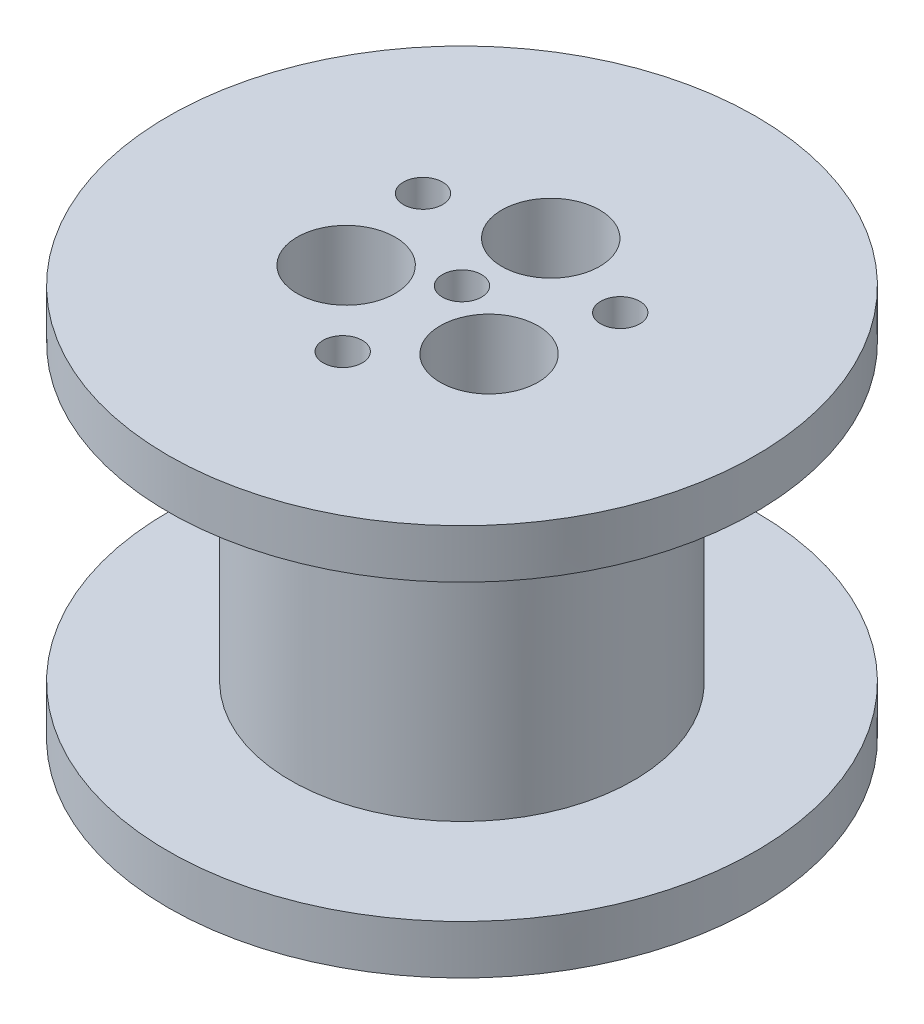
ISO-10303-21;
HEADER;
FILE_DESCRIPTION(('STEP AP214'),'2;1');
FILE_NAME('part.step','',(''),(''),'','','');
FILE_SCHEMA(('AUTOMOTIVE_DESIGN { 1 0 10303 214 1 1 1 1 }'));
ENDSEC;
DATA;
#1=APPLICATION_CONTEXT('core data for automotive mechanical design processes');
#2=APPLICATION_PROTOCOL_DEFINITION('international standard','automotive_design',2000,#1);
#3=PRODUCT_CONTEXT('',#1,'mechanical');
#4=PRODUCT('Part','Part','',(#3));
#5=PRODUCT_RELATED_PRODUCT_CATEGORY('part','',(#4));
#6=PRODUCT_DEFINITION_FORMATION('','',#4);
#7=PRODUCT_DEFINITION_CONTEXT('part definition',#1,'design');
#8=PRODUCT_DEFINITION('design','',#6,#7);
#9=PRODUCT_DEFINITION_SHAPE('','',#8);
#10=(LENGTH_UNIT() NAMED_UNIT(*) SI_UNIT(.MILLI.,.METRE.));
#11=(NAMED_UNIT(*) PLANE_ANGLE_UNIT() SI_UNIT($,.RADIAN.));
#12=(NAMED_UNIT(*) SI_UNIT($,.STERADIAN.) SOLID_ANGLE_UNIT());
#13=UNCERTAINTY_MEASURE_WITH_UNIT(LENGTH_MEASURE(1.E-05),#10,'distance_accuracy_value','');
#14=(GEOMETRIC_REPRESENTATION_CONTEXT(3) GLOBAL_UNCERTAINTY_ASSIGNED_CONTEXT((#13)) GLOBAL_UNIT_ASSIGNED_CONTEXT((#10,
#11,#12)) REPRESENTATION_CONTEXT('',''));
#15=CARTESIAN_POINT('',(0.,0.,0.));
#16=DIRECTION('',(0.,0.,1.));
#17=DIRECTION('',(1.,0.,0.));
#18=AXIS2_PLACEMENT_3D('',#15,#16,#17);
#19=CARTESIAN_POINT('',(0.,40.,0.));
#20=DIRECTION('',(0.,-1.,0.));
#21=DIRECTION('',(0.,0.,-1.));
#22=AXIS2_PLACEMENT_3D('',#19,#20,#21);
#23=CYLINDRICAL_SURFACE('',#22,30.);
#24=CARTESIAN_POINT('',(0.,40.,0.));
#25=DIRECTION('',(0.,1.,0.));
#26=DIRECTION('',(0.,0.,1.));
#27=AXIS2_PLACEMENT_3D('',#24,#25,#26);
#28=CIRCLE('',#27,30.);
#29=CARTESIAN_POINT('',(0.,40.,30.));
#30=VERTEX_POINT('',#29);
#31=EDGE_CURVE('E12',#30,#30,#28,.T.);
#32=ORIENTED_EDGE('',*,*,#31,.F.);
#33=EDGE_LOOP('',(#32));
#34=FACE_BOUND('',#33,.T.);
#35=CARTESIAN_POINT('',(0.,35.,0.));
#36=DIRECTION('',(0.,-1.,0.));
#37=DIRECTION('',(0.,0.,-1.));
#38=AXIS2_PLACEMENT_3D('',#35,#36,#37);
#39=CIRCLE('',#38,30.);
#40=CARTESIAN_POINT('',(0.,35.,-30.));
#41=VERTEX_POINT('',#40);
#42=EDGE_CURVE('E39',#41,#41,#39,.T.);
#43=ORIENTED_EDGE('',*,*,#42,.F.);
#44=EDGE_LOOP('',(#43));
#45=FACE_BOUND('',#44,.T.);
#46=ADVANCED_FACE('F35',(#34,#45),#23,.T.);
#47=CARTESIAN_POINT('',(0.,40.,0.));
#48=DIRECTION('',(0.,1.,0.));
#49=DIRECTION('',(0.,0.,1.));
#50=AXIS2_PLACEMENT_3D('',#47,#48,#49);
#51=PLANE('',#50);
#52=CARTESIAN_POINT('',(-0.27450383551459,40.,11.904684903192));
#53=DIRECTION('',(0.,1.,0.));
#54=DIRECTION('',(0.,0.,1.));
#55=AXIS2_PLACEMENT_3D('',#52,#53,#54);
#56=CIRCLE('',#55,2.);
#57=CARTESIAN_POINT('',(-0.27450383551459,40.,13.904684903192));
#58=VERTEX_POINT('',#57);
#59=EDGE_CURVE('E163',#58,#58,#56,.T.);
#60=ORIENTED_EDGE('',*,*,#59,.F.);
#61=EDGE_LOOP('',(#60));
#62=FACE_BOUND('',#61,.T.);
#63=CARTESIAN_POINT('',(-10.1720019326114,40.,-6.18976202331826));
#64=DIRECTION('',(0.,1.,0.));
#65=DIRECTION('',(0.,0.,1.));
#66=AXIS2_PLACEMENT_3D('',#63,#64,#65);
#67=CIRCLE('',#66,2.);
#68=CARTESIAN_POINT('',(-10.1720019326114,40.,-4.18976202331826));
#69=VERTEX_POINT('',#68);
#70=EDGE_CURVE('E168',#69,#69,#67,.T.);
#71=ORIENTED_EDGE('',*,*,#70,.F.);
#72=EDGE_LOOP('',(#71));
#73=FACE_BOUND('',#72,.T.);
#74=CARTESIAN_POINT('',(10.4464096450296,40.,-5.7142859537013));
#75=DIRECTION('',(0.,1.,0.));
#76=DIRECTION('',(0.,0.,1.));
#77=AXIS2_PLACEMENT_3D('',#74,#75,#76);
#78=CIRCLE('',#77,2.);
#79=CARTESIAN_POINT('',(10.4464096450296,40.,-3.7142859537013));
#80=VERTEX_POINT('',#79);
#81=EDGE_CURVE('E176',#80,#80,#78,.T.);
#82=ORIENTED_EDGE('',*,*,#81,.F.);
#83=EDGE_LOOP('',(#82));
#84=FACE_BOUND('',#83,.T.);
#85=CARTESIAN_POINT('',(0.317902701636574,40.,-8.74422311427903));
#86=DIRECTION('',(0.,-1.,0.));
#87=DIRECTION('',(0.,0.,-1.));
#88=AXIS2_PLACEMENT_3D('',#85,#86,#87);
#89=CIRCLE('',#88,5.);
#90=CARTESIAN_POINT('',(0.317902701636574,40.,-13.744223114279));
#91=VERTEX_POINT('',#90);
#92=EDGE_CURVE('E182',#91,#91,#89,.T.);
#93=ORIENTED_EDGE('',*,*,#92,.T.);
#94=EDGE_LOOP('',(#93));
#95=FACE_BOUND('',#94,.T.);
#96=CARTESIAN_POINT('',(7.41376800250643,40.,4.64742337268849));
#97=DIRECTION('',(0.,-1.,0.));
#98=DIRECTION('',(0.,0.,-1.));
#99=AXIS2_PLACEMENT_3D('',#96,#97,#98);
#100=CIRCLE('',#99,5.);
#101=CARTESIAN_POINT('',(7.41376800250643,40.,-0.352576627311507));
#102=VERTEX_POINT('',#101);
#103=EDGE_CURVE('E188',#102,#102,#100,.T.);
#104=ORIENTED_EDGE('',*,*,#103,.T.);
#105=EDGE_LOOP('',(#104));
#106=FACE_BOUND('',#105,.T.);
#107=CARTESIAN_POINT('',(-7.73167070414301,40.,4.09679974159054));
#108=DIRECTION('',(0.,-1.,0.));
#109=DIRECTION('',(0.,0.,-1.));
#110=AXIS2_PLACEMENT_3D('',#107,#108,#109);
#111=CIRCLE('',#110,5.);
#112=CARTESIAN_POINT('',(-7.73167070414301,40.,-0.903200258409464));
#113=VERTEX_POINT('',#112);
#114=EDGE_CURVE('E194',#113,#113,#111,.T.);
#115=ORIENTED_EDGE('',*,*,#114,.T.);
#116=EDGE_LOOP('',(#115));
#117=FACE_BOUND('',#116,.T.);
#118=CARTESIAN_POINT('',(0.,40.,0.));
#119=DIRECTION('',(0.,-1.,0.));
#120=DIRECTION('',(0.,0.,-1.));
#121=AXIS2_PLACEMENT_3D('',#118,#119,#120);
#122=CIRCLE('',#121,2.);
#123=CARTESIAN_POINT('',(0.,40.,-2.));
#124=VERTEX_POINT('',#123);
#125=EDGE_CURVE('E74',#124,#124,#122,.T.);
#126=ORIENTED_EDGE('',*,*,#125,.T.);
#127=EDGE_LOOP('',(#126));
#128=FACE_BOUND('',#127,.T.);
#129=ORIENTED_EDGE('',*,*,#31,.T.);
#130=EDGE_LOOP('',(#129));
#131=FACE_BOUND('',#130,.T.);
#132=ADVANCED_FACE('F94',(#62,#73,#84,#95,#106,#117,#128,#131),#51,.T.);
#133=CARTESIAN_POINT('',(0.,35.,0.));
#134=DIRECTION('',(0.,-1.,0.));
#135=DIRECTION('',(0.,0.,-1.));
#136=AXIS2_PLACEMENT_3D('',#133,#134,#135);
#137=PLANE('',#136);
#138=CARTESIAN_POINT('',(0.,35.,0.));
#139=DIRECTION('',(0.,-1.,0.));
#140=DIRECTION('',(0.,0.,-1.));
#141=AXIS2_PLACEMENT_3D('',#138,#139,#140);
#142=CIRCLE('',#141,17.5);
#143=CARTESIAN_POINT('',(0.,35.,-17.5));
#144=VERTEX_POINT('',#143);
#145=EDGE_CURVE('E62',#144,#144,#142,.T.);
#146=ORIENTED_EDGE('',*,*,#145,.F.);
#147=EDGE_LOOP('',(#146));
#148=FACE_BOUND('',#147,.T.);
#149=ORIENTED_EDGE('',*,*,#42,.T.);
#150=EDGE_LOOP('',(#149));
#151=FACE_BOUND('',#150,.T.);
#152=ADVANCED_FACE('F91',(#148,#151),#137,.T.);
#153=CARTESIAN_POINT('',(0.,5.,0.));
#154=DIRECTION('',(0.,-1.,0.));
#155=DIRECTION('',(0.,0.,-1.));
#156=AXIS2_PLACEMENT_3D('',#153,#154,#155);
#157=PLANE('',#156);
#158=CARTESIAN_POINT('',(0.,5.,0.));
#159=DIRECTION('',(0.,-1.,0.));
#160=DIRECTION('',(0.,0.,-1.));
#161=AXIS2_PLACEMENT_3D('',#158,#159,#160);
#162=CIRCLE('',#161,17.5);
#163=CARTESIAN_POINT('',(-14.2785338407005,5.,-10.1179776319169));
#164=VERTEX_POINT('',#163);
#165=CARTESIAN_POINT('',(-16.2005846637719,5.,-6.61748113347961));
#166=VERTEX_POINT('',#165);
#167=EDGE_CURVE('E63',#164,#166,#162,.T.);
#168=ORIENTED_EDGE('',*,*,#167,.T.);
#169=CARTESIAN_POINT('',(-15.3397371273536,5.,-8.42273499901836));
#170=DIRECTION('',(0.,1.,0.));
#171=DIRECTION('',(0.,0.,1.));
#172=AXIS2_PLACEMENT_3D('',#169,#170,#171);
#173=CIRCLE('',#172,2.);
#174=EDGE_CURVE('E51',#164,#166,#173,.T.);
#175=ORIENTED_EDGE('',*,*,#174,.F.);
#176=EDGE_LOOP('',(#168,#175));
#177=FACE_BOUND('',#176,.T.);
#178=CARTESIAN_POINT('',(0.,5.,0.));
#179=DIRECTION('',(0.,-1.,0.));
#180=DIRECTION('',(0.,0.,-1.));
#181=AXIS2_PLACEMENT_3D('',#178,#179,#180);
#182=CIRCLE('',#181,30.);
#183=CARTESIAN_POINT('',(0.,5.,-30.));
#184=VERTEX_POINT('',#183);
#185=EDGE_CURVE('E82',#184,#184,#182,.T.);
#186=ORIENTED_EDGE('',*,*,#185,.F.);
#187=EDGE_LOOP('',(#186));
#188=FACE_BOUND('',#187,.T.);
#189=ADVANCED_FACE('F70',(#177,#188),#157,.F.);
#190=CARTESIAN_POINT('',(0.,35.,0.));
#191=DIRECTION('',(0.,-1.,0.));
#192=DIRECTION('',(0.,0.,-1.));
#193=AXIS2_PLACEMENT_3D('',#190,#191,#192);
#194=CYLINDRICAL_SURFACE('',#193,17.5);
#195=ORIENTED_EDGE('',*,*,#145,.T.);
#196=EDGE_LOOP('',(#195));
#197=FACE_BOUND('',#196,.T.);
#198=EDGE_CURVE('E56',#166,#164,#162,.T.);
#199=ORIENTED_EDGE('',*,*,#198,.F.);
#200=ORIENTED_EDGE('',*,*,#167,.F.);
#201=EDGE_LOOP('',(#199,#200));
#202=FACE_BOUND('',#201,.T.);
#203=ADVANCED_FACE('F73',(#197,#202),#194,.T.);
#204=CARTESIAN_POINT('',(0.,0.,0.));
#205=DIRECTION('',(0.,1.,0.));
#206=DIRECTION('',(0.,0.,1.));
#207=AXIS2_PLACEMENT_3D('',#204,#205,#206);
#208=PLANE('',#207);
#209=CARTESIAN_POINT('',(-0.27450383551459,0.,11.904684903192));
#210=DIRECTION('',(0.,1.,0.));
#211=DIRECTION('',(0.,0.,1.));
#212=AXIS2_PLACEMENT_3D('',#209,#210,#211);
#213=CIRCLE('',#212,2.);
#214=CARTESIAN_POINT('',(-0.27450383551459,0.,13.904684903192));
#215=VERTEX_POINT('',#214);
#216=EDGE_CURVE('E67',#215,#215,#213,.T.);
#217=ORIENTED_EDGE('',*,*,#216,.T.);
#218=EDGE_LOOP('',(#217));
#219=FACE_BOUND('',#218,.T.);
#220=CARTESIAN_POINT('',(-10.1720019326114,0.,-6.18976202331826));
#221=DIRECTION('',(0.,1.,0.));
#222=DIRECTION('',(0.,0.,1.));
#223=AXIS2_PLACEMENT_3D('',#220,#221,#222);
#224=CIRCLE('',#223,2.);
#225=CARTESIAN_POINT('',(-10.1720019326114,0.,-4.18976202331826));
#226=VERTEX_POINT('',#225);
#227=EDGE_CURVE('E164',#226,#226,#224,.T.);
#228=ORIENTED_EDGE('',*,*,#227,.T.);
#229=EDGE_LOOP('',(#228));
#230=FACE_BOUND('',#229,.T.);
#231=CARTESIAN_POINT('',(10.4464096450296,0.,-5.7142859537013));
#232=DIRECTION('',(0.,1.,0.));
#233=DIRECTION('',(0.,0.,1.));
#234=AXIS2_PLACEMENT_3D('',#231,#232,#233);
#235=CIRCLE('',#234,2.);
#236=CARTESIAN_POINT('',(10.4464096450296,0.,-3.7142859537013));
#237=VERTEX_POINT('',#236);
#238=EDGE_CURVE('E173',#237,#237,#235,.T.);
#239=ORIENTED_EDGE('',*,*,#238,.T.);
#240=EDGE_LOOP('',(#239));
#241=FACE_BOUND('',#240,.T.);
#242=CARTESIAN_POINT('',(-15.3397371273536,0.,-8.42273499901836));
#243=DIRECTION('',(0.,1.,0.));
#244=DIRECTION('',(0.,0.,1.));
#245=AXIS2_PLACEMENT_3D('',#242,#243,#244);
#246=CIRCLE('',#245,2.);
#247=CARTESIAN_POINT('',(-15.3397371273536,0.,-6.42273499901836));
#248=VERTEX_POINT('',#247);
#249=EDGE_CURVE('E72',#248,#248,#246,.F.);
#250=ORIENTED_EDGE('',*,*,#249,.F.);
#251=EDGE_LOOP('',(#250));
#252=FACE_BOUND('',#251,.T.);
#253=CARTESIAN_POINT('',(0.317902701636574,0.,-8.74422311427903));
#254=DIRECTION('',(0.,-1.,0.));
#255=DIRECTION('',(0.,0.,-1.));
#256=AXIS2_PLACEMENT_3D('',#253,#254,#255);
#257=CIRCLE('',#256,5.);
#258=CARTESIAN_POINT('',(0.317902701636574,0.,-13.744223114279));
#259=VERTEX_POINT('',#258);
#260=EDGE_CURVE('E185',#259,#259,#257,.T.);
#261=ORIENTED_EDGE('',*,*,#260,.F.);
#262=EDGE_LOOP('',(#261));
#263=FACE_BOUND('',#262,.T.);
#264=CARTESIAN_POINT('',(7.41376800250643,0.,4.64742337268849));
#265=DIRECTION('',(0.,-1.,0.));
#266=DIRECTION('',(0.,0.,-1.));
#267=AXIS2_PLACEMENT_3D('',#264,#265,#266);
#268=CIRCLE('',#267,5.);
#269=CARTESIAN_POINT('',(7.41376800250643,0.,-0.352576627311507));
#270=VERTEX_POINT('',#269);
#271=EDGE_CURVE('E191',#270,#270,#268,.T.);
#272=ORIENTED_EDGE('',*,*,#271,.F.);
#273=EDGE_LOOP('',(#272));
#274=FACE_BOUND('',#273,.T.);
#275=CARTESIAN_POINT('',(-7.73167070414301,0.,4.09679974159054));
#276=DIRECTION('',(0.,-1.,0.));
#277=DIRECTION('',(0.,0.,-1.));
#278=AXIS2_PLACEMENT_3D('',#275,#276,#277);
#279=CIRCLE('',#278,5.);
#280=CARTESIAN_POINT('',(-7.73167070414301,0.,-0.903200258409464));
#281=VERTEX_POINT('',#280);
#282=EDGE_CURVE('E181',#281,#281,#279,.T.);
#283=ORIENTED_EDGE('',*,*,#282,.F.);
#284=EDGE_LOOP('',(#283));
#285=FACE_BOUND('',#284,.T.);
#286=CARTESIAN_POINT('',(0.,0.,0.));
#287=DIRECTION('',(0.,-1.,0.));
#288=DIRECTION('',(0.,0.,-1.));
#289=AXIS2_PLACEMENT_3D('',#286,#287,#288);
#290=CIRCLE('',#289,2.);
#291=CARTESIAN_POINT('',(0.,0.,-2.));
#292=VERTEX_POINT('',#291);
#293=EDGE_CURVE('E76',#292,#292,#290,.T.);
#294=ORIENTED_EDGE('',*,*,#293,.F.);
#295=EDGE_LOOP('',(#294));
#296=FACE_BOUND('',#295,.T.);
#297=CARTESIAN_POINT('',(0.,0.,0.));
#298=DIRECTION('',(0.,1.,0.));
#299=DIRECTION('',(0.,0.,1.));
#300=AXIS2_PLACEMENT_3D('',#297,#298,#299);
#301=CIRCLE('',#300,30.);
#302=CARTESIAN_POINT('',(0.,0.,30.));
#303=VERTEX_POINT('',#302);
#304=EDGE_CURVE('E44',#303,#303,#301,.T.);
#305=ORIENTED_EDGE('',*,*,#304,.F.);
#306=EDGE_LOOP('',(#305));
#307=FACE_BOUND('',#306,.T.);
#308=ADVANCED_FACE('F109',(#219,#230,#241,#252,#263,#274,#285,#296,#307),#208,.F.);
#309=ORIENTED_EDGE('',*,*,#185,.T.);
#310=EDGE_LOOP('',(#309));
#311=FACE_BOUND('',#310,.T.);
#312=ORIENTED_EDGE('',*,*,#304,.T.);
#313=EDGE_LOOP('',(#312));
#314=FACE_BOUND('',#313,.T.);
#315=ADVANCED_FACE('F37',(#311,#314),#23,.T.);
#316=CARTESIAN_POINT('',(0.,40.,0.));
#317=DIRECTION('',(0.,-1.,0.));
#318=DIRECTION('',(0.,0.,-1.));
#319=AXIS2_PLACEMENT_3D('',#316,#317,#318);
#320=CYLINDRICAL_SURFACE('',#319,2.);
#321=ORIENTED_EDGE('',*,*,#125,.F.);
#322=EDGE_LOOP('',(#321));
#323=FACE_BOUND('',#322,.T.);
#324=ORIENTED_EDGE('',*,*,#293,.T.);
#325=EDGE_LOOP('',(#324));
#326=FACE_BOUND('',#325,.T.);
#327=ADVANCED_FACE('F108',(#323,#326),#320,.F.);
#328=CARTESIAN_POINT('',(-7.73167070414301,40.,4.09679974159054));
#329=DIRECTION('',(0.,-1.,0.));
#330=DIRECTION('',(0.,0.,-1.));
#331=AXIS2_PLACEMENT_3D('',#328,#329,#330);
#332=CYLINDRICAL_SURFACE('',#331,5.);
#333=ORIENTED_EDGE('',*,*,#114,.F.);
#334=EDGE_LOOP('',(#333));
#335=FACE_BOUND('',#334,.T.);
#336=ORIENTED_EDGE('',*,*,#282,.T.);
#337=EDGE_LOOP('',(#336));
#338=FACE_BOUND('',#337,.T.);
#339=ADVANCED_FACE('F114',(#335,#338),#332,.F.);
#340=CARTESIAN_POINT('',(7.41376800250643,40.,4.64742337268849));
#341=DIRECTION('',(0.,-1.,0.));
#342=DIRECTION('',(0.,0.,-1.));
#343=AXIS2_PLACEMENT_3D('',#340,#341,#342);
#344=CYLINDRICAL_SURFACE('',#343,5.);
#345=ORIENTED_EDGE('',*,*,#103,.F.);
#346=EDGE_LOOP('',(#345));
#347=FACE_BOUND('',#346,.T.);
#348=ORIENTED_EDGE('',*,*,#271,.T.);
#349=EDGE_LOOP('',(#348));
#350=FACE_BOUND('',#349,.T.);
#351=ADVANCED_FACE('F133',(#347,#350),#344,.F.);
#352=CARTESIAN_POINT('',(0.317902701636574,40.,-8.74422311427903));
#353=DIRECTION('',(0.,-1.,0.));
#354=DIRECTION('',(0.,0.,-1.));
#355=AXIS2_PLACEMENT_3D('',#352,#353,#354);
#356=CYLINDRICAL_SURFACE('',#355,5.);
#357=ORIENTED_EDGE('',*,*,#92,.F.);
#358=EDGE_LOOP('',(#357));
#359=FACE_BOUND('',#358,.T.);
#360=ORIENTED_EDGE('',*,*,#260,.T.);
#361=EDGE_LOOP('',(#360));
#362=FACE_BOUND('',#361,.T.);
#363=ADVANCED_FACE('F137',(#359,#362),#356,.F.);
#364=CARTESIAN_POINT('',(-15.3397371273536,-0.00100000000000013,-8.42273499901836));
#365=DIRECTION('',(0.,1.,0.));
#366=DIRECTION('',(0.,0.,1.));
#367=AXIS2_PLACEMENT_3D('',#364,#365,#366);
#368=CYLINDRICAL_SURFACE('',#367,2.);
#369=ORIENTED_EDGE('',*,*,#174,.T.);
#370=EDGE_CURVE('E58',#166,#164,#173,.T.);
#371=ORIENTED_EDGE('',*,*,#370,.T.);
#372=EDGE_LOOP('',(#369,#371));
#373=FACE_BOUND('',#372,.T.);
#374=ORIENTED_EDGE('',*,*,#249,.T.);
#375=EDGE_LOOP('',(#374));
#376=FACE_BOUND('',#375,.T.);
#377=ADVANCED_FACE('F65',(#373,#376),#368,.F.);
#378=CARTESIAN_POINT('',(-15.3397371273536,5.,-8.42273499901836));
#379=DIRECTION('',(0.,1.,0.));
#380=DIRECTION('',(0.,0.,1.));
#381=AXIS2_PLACEMENT_3D('',#378,#379,#380);
#382=PLANE('',#381);
#383=ORIENTED_EDGE('',*,*,#198,.T.);
#384=ORIENTED_EDGE('',*,*,#370,.F.);
#385=EDGE_LOOP('',(#383,#384));
#386=FACE_BOUND('',#385,.T.);
#387=ADVANCED_FACE('F57',(#386),#382,.F.);
#388=CARTESIAN_POINT('',(10.4464096450296,0.,-5.7142859537013));
#389=DIRECTION('',(0.,1.,0.));
#390=DIRECTION('',(0.,0.,1.));
#391=AXIS2_PLACEMENT_3D('',#388,#389,#390);
#392=CYLINDRICAL_SURFACE('',#391,2.);
#393=ORIENTED_EDGE('',*,*,#238,.F.);
#394=EDGE_LOOP('',(#393));
#395=FACE_BOUND('',#394,.T.);
#396=ORIENTED_EDGE('',*,*,#81,.T.);
#397=EDGE_LOOP('',(#396));
#398=FACE_BOUND('',#397,.T.);
#399=ADVANCED_FACE('F146',(#395,#398),#392,.F.);
#400=CARTESIAN_POINT('',(-10.1720019326114,0.,-6.18976202331826));
#401=DIRECTION('',(0.,1.,0.));
#402=DIRECTION('',(0.,0.,1.));
#403=AXIS2_PLACEMENT_3D('',#400,#401,#402);
#404=CYLINDRICAL_SURFACE('',#403,2.);
#405=ORIENTED_EDGE('',*,*,#227,.F.);
#406=EDGE_LOOP('',(#405));
#407=FACE_BOUND('',#406,.T.);
#408=ORIENTED_EDGE('',*,*,#70,.T.);
#409=EDGE_LOOP('',(#408));
#410=FACE_BOUND('',#409,.T.);
#411=ADVANCED_FACE('F149',(#407,#410),#404,.F.);
#412=CARTESIAN_POINT('',(-0.27450383551459,0.,11.904684903192));
#413=DIRECTION('',(0.,1.,0.));
#414=DIRECTION('',(0.,0.,1.));
#415=AXIS2_PLACEMENT_3D('',#412,#413,#414);
#416=CYLINDRICAL_SURFACE('',#415,2.);
#417=ORIENTED_EDGE('',*,*,#216,.F.);
#418=EDGE_LOOP('',(#417));
#419=FACE_BOUND('',#418,.T.);
#420=ORIENTED_EDGE('',*,*,#59,.T.);
#421=EDGE_LOOP('',(#420));
#422=FACE_BOUND('',#421,.T.);
#423=ADVANCED_FACE('F153',(#419,#422),#416,.F.);
#424=CLOSED_SHELL('',(#46,#132,#152,#189,#203,#308,#315,#327,#339,#351,#363,#377,#387,#399,#411,#423));
#425=MANIFOLD_SOLID_BREP('B2',#424);
#426=ADVANCED_BREP_SHAPE_REPRESENTATION('',(#18,#425),#14);
#427=SHAPE_DEFINITION_REPRESENTATION(#9,#426);
ENDSEC;
END-ISO-10303-21;
